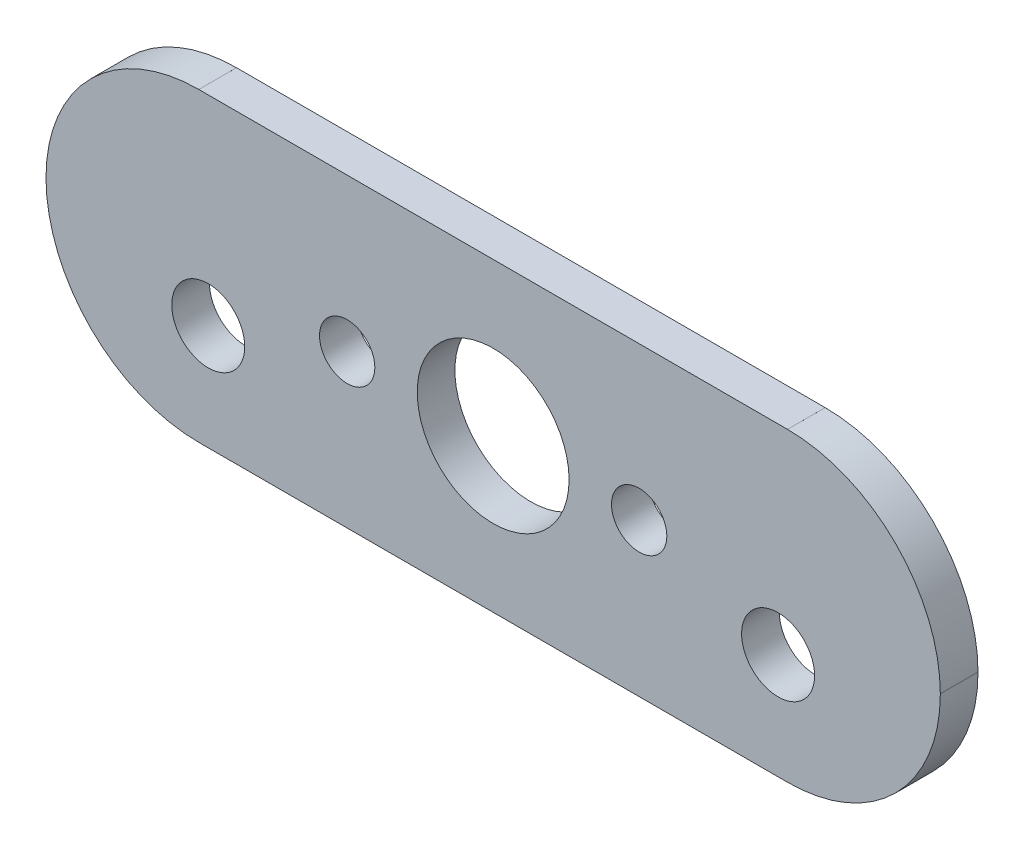
ISO-10303-21;
HEADER;
FILE_DESCRIPTION(('STEP AP214'),'2;1');
FILE_NAME('part.step','',(''),(''),'','','');
FILE_SCHEMA(('AUTOMOTIVE_DESIGN { 1 0 10303 214 1 1 1 1 }'));
ENDSEC;
DATA;
#1=APPLICATION_CONTEXT('core data for automotive mechanical design processes');
#2=APPLICATION_PROTOCOL_DEFINITION('international standard','automotive_design',2000,#1);
#3=PRODUCT_CONTEXT('',#1,'mechanical');
#4=PRODUCT('Part','Part','',(#3));
#5=PRODUCT_RELATED_PRODUCT_CATEGORY('part','',(#4));
#6=PRODUCT_DEFINITION_FORMATION('','',#4);
#7=PRODUCT_DEFINITION_CONTEXT('part definition',#1,'design');
#8=PRODUCT_DEFINITION('design','',#6,#7);
#9=PRODUCT_DEFINITION_SHAPE('','',#8);
#10=(LENGTH_UNIT() NAMED_UNIT(*) SI_UNIT(.MILLI.,.METRE.));
#11=(NAMED_UNIT(*) PLANE_ANGLE_UNIT() SI_UNIT($,.RADIAN.));
#12=(NAMED_UNIT(*) SI_UNIT($,.STERADIAN.) SOLID_ANGLE_UNIT());
#13=UNCERTAINTY_MEASURE_WITH_UNIT(LENGTH_MEASURE(1.E-05),#10,'distance_accuracy_value','');
#14=(GEOMETRIC_REPRESENTATION_CONTEXT(3) GLOBAL_UNCERTAINTY_ASSIGNED_CONTEXT((#13)) GLOBAL_UNIT_ASSIGNED_CONTEXT((#10,
#11,#12)) REPRESENTATION_CONTEXT('',''));
#15=CARTESIAN_POINT('',(0.,0.,0.));
#16=DIRECTION('',(0.,0.,1.));
#17=DIRECTION('',(1.,0.,0.));
#18=AXIS2_PLACEMENT_3D('',#15,#16,#17);
#19=CARTESIAN_POINT('',(-12.4999999999912,-6.49016509789208,1.6));
#20=DIRECTION('',(0.,0.,-1.));
#21=DIRECTION('',(-1.,0.,0.));
#22=AXIS2_PLACEMENT_3D('',#19,#20,#21);
#23=CYLINDRICAL_SURFACE('',#22,0.000299999999999953);
#24=CARTESIAN_POINT('',(-12.4999999999912,-6.49016509789208,0.));
#25=DIRECTION('',(0.,0.,1.));
#26=DIRECTION('',(1.,0.,0.));
#27=AXIS2_PLACEMENT_3D('',#24,#25,#26);
#28=CIRCLE('',#27,0.000299999999999953);
#29=CARTESIAN_POINT('',(-12.4996999999912,-6.49016509753605,0.));
#30=VERTEX_POINT('',#29);
#31=CARTESIAN_POINT('',(-12.5002999999829,-6.49016509095849,0.));
#32=VERTEX_POINT('',#31);
#33=EDGE_CURVE('E183',#30,#32,#28,.T.);
#34=ORIENTED_EDGE('',*,*,#33,.F.);
#35=DIRECTION('',(0.,0.,-1.));
#36=VECTOR('',#35,1.);
#37=CARTESIAN_POINT('',(-12.4996999999912,-6.49016509753605,1.6));
#38=LINE('',#37,#36);
#39=CARTESIAN_POINT('',(-12.4996999999912,-6.49016509753605,1.6));
#40=VERTEX_POINT('',#39);
#41=EDGE_CURVE('E11',#40,#30,#38,.T.);
#42=ORIENTED_EDGE('',*,*,#41,.F.);
#43=CARTESIAN_POINT('',(-12.4999999999912,-6.49016509789208,1.6));
#44=DIRECTION('',(0.,0.,1.));
#45=DIRECTION('',(1.,0.,0.));
#46=AXIS2_PLACEMENT_3D('',#43,#44,#45);
#47=CIRCLE('',#46,0.000299999999999953);
#48=CARTESIAN_POINT('',(-12.5002999999829,-6.49016509095849,1.6));
#49=VERTEX_POINT('',#48);
#50=EDGE_CURVE('E246',#40,#49,#47,.T.);
#51=ORIENTED_EDGE('',*,*,#50,.T.);
#52=DIRECTION('',(0.,0.,-1.));
#53=VECTOR('',#52,1.);
#54=CARTESIAN_POINT('',(-12.5002999999829,-6.49016509095849,1.6));
#55=LINE('',#54,#53);
#56=EDGE_CURVE('E105',#49,#32,#55,.T.);
#57=ORIENTED_EDGE('',*,*,#56,.T.);
#58=EDGE_LOOP('',(#34,#42,#51,#57));
#59=FACE_BOUND('',#58,.T.);
#60=ADVANCED_FACE('F41',(#59),#23,.F.);
#61=CARTESIAN_POINT('',(7.70224696459174E-06,-6.49015026339018,1.6));
#62=DIRECTION('',(-1.18675942035323E-06,0.999999999999296,0.));
#63=DIRECTION('',(-0.999999999999296,-1.18675942035323E-06,0.));
#64=AXIS2_PLACEMENT_3D('',#61,#62,#63);
#65=PLANE('',#64);
#66=DIRECTION('',(0.999999999999296,1.18675942035323E-06,0.));
#67=VECTOR('',#66,1.);
#68=CARTESIAN_POINT('',(7.70224696459174E-06,-6.49015026339018,0.));
#69=LINE('',#68,#67);
#70=CARTESIAN_POINT('',(12.4996999999912,-6.4901354292626,0.));
#71=VERTEX_POINT('',#70);
#72=EDGE_CURVE('E187',#30,#71,#69,.T.);
#73=ORIENTED_EDGE('',*,*,#72,.T.);
#74=DIRECTION('',(0.,0.,-1.));
#75=VECTOR('',#74,1.);
#76=CARTESIAN_POINT('',(12.4996999999912,-6.4901354292626,1.6));
#77=LINE('',#76,#75);
#78=CARTESIAN_POINT('',(12.4996999999912,-6.4901354292626,1.6));
#79=VERTEX_POINT('',#78);
#80=EDGE_CURVE('E50',#79,#71,#77,.T.);
#81=ORIENTED_EDGE('',*,*,#80,.F.);
#82=DIRECTION('',(0.999999999999296,1.18675942035323E-06,0.));
#83=VECTOR('',#82,1.);
#84=CARTESIAN_POINT('',(7.70224696459174E-06,-6.49015026339018,1.6));
#85=LINE('',#84,#83);
#86=EDGE_CURVE('E297',#40,#79,#85,.T.);
#87=ORIENTED_EDGE('',*,*,#86,.F.);
#88=ORIENTED_EDGE('',*,*,#41,.T.);
#89=EDGE_LOOP('',(#73,#81,#87,#88));
#90=FACE_BOUND('',#89,.T.);
#91=ADVANCED_FACE('F280',(#90),#65,.F.);
#92=CARTESIAN_POINT('',(12.4999999999912,-6.49013542890657,1.6));
#93=DIRECTION('',(0.,0.,-1.));
#94=DIRECTION('',(-1.,0.,0.));
#95=AXIS2_PLACEMENT_3D('',#92,#93,#94);
#96=CYLINDRICAL_SURFACE('',#95,0.000299999999999953);
#97=CARTESIAN_POINT('',(12.4999999999912,-6.49013542890657,0.));
#98=DIRECTION('',(0.,0.,1.));
#99=DIRECTION('',(1.,0.,0.));
#100=AXIS2_PLACEMENT_3D('',#97,#98,#99);
#101=CIRCLE('',#100,0.000299999999999953);
#102=CARTESIAN_POINT('',(12.500299999994,-6.49013541502723,0.));
#103=VERTEX_POINT('',#102);
#104=EDGE_CURVE('E191',#103,#71,#101,.T.);
#105=ORIENTED_EDGE('',*,*,#104,.F.);
#106=DIRECTION('',(0.,0.,-1.));
#107=VECTOR('',#106,1.);
#108=CARTESIAN_POINT('',(12.500299999994,-6.49013541502723,1.6));
#109=LINE('',#108,#107);
#110=CARTESIAN_POINT('',(12.500299999994,-6.49013541502723,1.6));
#111=VERTEX_POINT('',#110);
#112=EDGE_CURVE('E268',#111,#103,#109,.T.);
#113=ORIENTED_EDGE('',*,*,#112,.F.);
#114=CARTESIAN_POINT('',(12.4999999999912,-6.49013542890657,1.6));
#115=DIRECTION('',(0.,0.,1.));
#116=DIRECTION('',(1.,0.,0.));
#117=AXIS2_PLACEMENT_3D('',#114,#115,#116);
#118=CIRCLE('',#117,0.000299999999999953);
#119=EDGE_CURVE('E277',#111,#79,#118,.T.);
#120=ORIENTED_EDGE('',*,*,#119,.T.);
#121=ORIENTED_EDGE('',*,*,#80,.T.);
#122=EDGE_LOOP('',(#105,#113,#120,#121));
#123=FACE_BOUND('',#122,.T.);
#124=ADVANCED_FACE('F275',(#123),#96,.F.);
#125=CARTESIAN_POINT('',(12.4998497365919,1.48344927578849E-05,1.6));
#126=DIRECTION('',(0.,0.,-1.));
#127=DIRECTION('',(-1.,0.,0.));
#128=AXIS2_PLACEMENT_3D('',#125,#126,#127);
#129=CYLINDRICAL_SURFACE('',#128,6.49015026513882);
#130=CARTESIAN_POINT('',(12.4998497365919,1.48344927578849E-05,0.));
#131=DIRECTION('',(0.,0.,1.));
#132=DIRECTION('',(1.,0.,0.));
#133=AXIS2_PLACEMENT_3D('',#130,#131,#132);
#134=CIRCLE('',#133,6.49015026513882);
#135=CARTESIAN_POINT('',(18.9899999999912,-0.000135428906555711,0.));
#136=VERTEX_POINT('',#135);
#137=EDGE_CURVE('E195',#103,#136,#134,.T.);
#138=ORIENTED_EDGE('',*,*,#137,.T.);
#139=DIRECTION('',(0.,0.,-1.));
#140=VECTOR('',#139,1.);
#141=CARTESIAN_POINT('',(18.9899999999912,-0.000135428906555711,1.6));
#142=LINE('',#141,#140);
#143=CARTESIAN_POINT('',(18.9899999999912,-0.000135428906555711,1.6));
#144=VERTEX_POINT('',#143);
#145=EDGE_CURVE('E265',#144,#136,#142,.T.);
#146=ORIENTED_EDGE('',*,*,#145,.F.);
#147=CARTESIAN_POINT('',(12.4998497365919,1.48344927578849E-05,1.6));
#148=DIRECTION('',(0.,0.,1.));
#149=DIRECTION('',(1.,0.,0.));
#150=AXIS2_PLACEMENT_3D('',#147,#148,#149);
#151=CIRCLE('',#150,6.49015026513882);
#152=EDGE_CURVE('E292',#111,#144,#151,.T.);
#153=ORIENTED_EDGE('',*,*,#152,.F.);
#154=ORIENTED_EDGE('',*,*,#112,.T.);
#155=EDGE_LOOP('',(#138,#146,#153,#154));
#156=FACE_BOUND('',#155,.T.);
#157=ADVANCED_FACE('F289',(#156),#129,.T.);
#158=CARTESIAN_POINT('',(18.9899999999912,0.,1.6));
#159=DIRECTION('',(1.,0.,0.));
#160=DIRECTION('',(0.,0.,-1.));
#161=AXIS2_PLACEMENT_3D('',#158,#159,#160);
#162=PLANE('',#161);
#163=DIRECTION('',(0.,-1.,0.));
#164=VECTOR('',#163,1.);
#165=CARTESIAN_POINT('',(18.9899999999912,0.,0.));
#166=LINE('',#165,#164);
#167=CARTESIAN_POINT('',(18.9899999999912,0.0198645710934443,0.));
#168=VERTEX_POINT('',#167);
#169=EDGE_CURVE('E199',#168,#136,#166,.T.);
#170=ORIENTED_EDGE('',*,*,#169,.F.);
#171=DIRECTION('',(0.,0.,-1.));
#172=VECTOR('',#171,1.);
#173=CARTESIAN_POINT('',(18.9899999999912,0.0198645710934443,1.6));
#174=LINE('',#173,#172);
#175=CARTESIAN_POINT('',(18.9899999999912,0.0198645710934443,1.6));
#176=VERTEX_POINT('',#175);
#177=EDGE_CURVE('E262',#176,#168,#174,.T.);
#178=ORIENTED_EDGE('',*,*,#177,.F.);
#179=DIRECTION('',(0.,-1.,0.));
#180=VECTOR('',#179,1.);
#181=CARTESIAN_POINT('',(18.9899999999912,0.,1.6));
#182=LINE('',#181,#180);
#183=EDGE_CURVE('E295',#176,#144,#182,.T.);
#184=ORIENTED_EDGE('',*,*,#183,.T.);
#185=ORIENTED_EDGE('',*,*,#145,.T.);
#186=EDGE_LOOP('',(#170,#178,#184,#185));
#187=FACE_BOUND('',#186,.T.);
#188=ADVANCED_FACE('F336',(#187),#162,.T.);
#189=CARTESIAN_POINT('',(12.4998801803508,-1.48351262090757E-05,1.6));
#190=DIRECTION('',(0.,0.,-1.));
#191=DIRECTION('',(-1.,0.,0.));
#192=AXIS2_PLACEMENT_3D('',#189,#190,#191);
#193=CYLINDRICAL_SURFACE('',#192,6.49015026513882);
#194=CARTESIAN_POINT('',(12.4998801803508,-1.48351262090757E-05,0.));
#195=DIRECTION('',(0.,0.,1.));
#196=DIRECTION('',(1.,0.,0.));
#197=AXIS2_PLACEMENT_3D('',#194,#195,#196);
#198=CIRCLE('',#197,6.49015026513882);
#199=CARTESIAN_POINT('',(12.5002999999802,6.49013541643445,0.));
#200=VERTEX_POINT('',#199);
#201=EDGE_CURVE('E203',#168,#200,#198,.T.);
#202=ORIENTED_EDGE('',*,*,#201,.T.);
#203=DIRECTION('',(0.,0.,-1.));
#204=VECTOR('',#203,1.);
#205=CARTESIAN_POINT('',(12.5002999999802,6.49013541643445,1.6));
#206=LINE('',#205,#204);
#207=CARTESIAN_POINT('',(12.5002999999802,6.49013541643445,1.6));
#208=VERTEX_POINT('',#207);
#209=EDGE_CURVE('E259',#208,#200,#206,.T.);
#210=ORIENTED_EDGE('',*,*,#209,.F.);
#211=CARTESIAN_POINT('',(12.4998801803508,-1.48351262090757E-05,1.6));
#212=DIRECTION('',(0.,0.,1.));
#213=DIRECTION('',(1.,0.,0.));
#214=AXIS2_PLACEMENT_3D('',#211,#212,#213);
#215=CIRCLE('',#214,6.49015026513882);
#216=EDGE_CURVE('E306',#176,#208,#215,.T.);
#217=ORIENTED_EDGE('',*,*,#216,.F.);
#218=ORIENTED_EDGE('',*,*,#177,.T.);
#219=EDGE_LOOP('',(#202,#210,#217,#218));
#220=FACE_BOUND('',#219,.T.);
#221=ADVANCED_FACE('F339',(#220),#193,.T.);
#222=CARTESIAN_POINT('',(12.5,6.49013542890657,1.6));
#223=DIRECTION('',(0.,0.,-1.));
#224=DIRECTION('',(-1.,0.,0.));
#225=AXIS2_PLACEMENT_3D('',#222,#223,#224);
#226=CYLINDRICAL_SURFACE('',#225,0.000299999999999953);
#227=CARTESIAN_POINT('',(12.5,6.49013542890657,0.));
#228=DIRECTION('',(0.,0.,1.));
#229=DIRECTION('',(1.,0.,0.));
#230=AXIS2_PLACEMENT_3D('',#227,#228,#229);
#231=CIRCLE('',#230,0.000299999999999953);
#232=CARTESIAN_POINT('',(12.4997,6.49013542890657,0.));
#233=VERTEX_POINT('',#232);
#234=EDGE_CURVE('E207',#233,#200,#231,.T.);
#235=ORIENTED_EDGE('',*,*,#234,.F.);
#236=DIRECTION('',(0.,0.,-1.));
#237=VECTOR('',#236,1.);
#238=CARTESIAN_POINT('',(12.4997,6.49013542890657,1.6));
#239=LINE('',#238,#237);
#240=CARTESIAN_POINT('',(12.4997,6.49013542890657,1.6));
#241=VERTEX_POINT('',#240);
#242=EDGE_CURVE('E256',#241,#233,#239,.T.);
#243=ORIENTED_EDGE('',*,*,#242,.F.);
#244=CARTESIAN_POINT('',(12.5,6.49013542890657,1.6));
#245=DIRECTION('',(0.,0.,1.));
#246=DIRECTION('',(1.,0.,0.));
#247=AXIS2_PLACEMENT_3D('',#244,#245,#246);
#248=CIRCLE('',#247,0.000299999999999953);
#249=EDGE_CURVE('E309',#241,#208,#248,.T.);
#250=ORIENTED_EDGE('',*,*,#249,.T.);
#251=ORIENTED_EDGE('',*,*,#209,.T.);
#252=EDGE_LOOP('',(#235,#243,#250,#251));
#253=FACE_BOUND('',#252,.T.);
#254=ADVANCED_FACE('F343',(#253),#226,.F.);
#255=CARTESIAN_POINT('',(0.,6.49013542890657,1.6));
#256=DIRECTION('',(0.,-1.,0.));
#257=DIRECTION('',(1.,0.,0.));
#258=AXIS2_PLACEMENT_3D('',#255,#256,#257);
#259=PLANE('',#258);
#260=DIRECTION('',(-1.,0.,0.));
#261=VECTOR('',#260,1.);
#262=CARTESIAN_POINT('',(0.,6.49013542890657,0.));
#263=LINE('',#262,#261);
#264=CARTESIAN_POINT('',(-12.4997,6.49013542890657,0.));
#265=VERTEX_POINT('',#264);
#266=EDGE_CURVE('E211',#233,#265,#263,.T.);
#267=ORIENTED_EDGE('',*,*,#266,.T.);
#268=DIRECTION('',(0.,0.,-1.));
#269=VECTOR('',#268,1.);
#270=CARTESIAN_POINT('',(-12.4997,6.49013542890657,1.6));
#271=LINE('',#270,#269);
#272=CARTESIAN_POINT('',(-12.4997,6.49013542890657,1.6));
#273=VERTEX_POINT('',#272);
#274=EDGE_CURVE('E253',#273,#265,#271,.T.);
#275=ORIENTED_EDGE('',*,*,#274,.F.);
#276=DIRECTION('',(-1.,0.,0.));
#277=VECTOR('',#276,1.);
#278=CARTESIAN_POINT('',(0.,6.49013542890657,1.6));
#279=LINE('',#278,#277);
#280=EDGE_CURVE('E313',#241,#273,#279,.T.);
#281=ORIENTED_EDGE('',*,*,#280,.F.);
#282=ORIENTED_EDGE('',*,*,#242,.T.);
#283=EDGE_LOOP('',(#267,#275,#281,#282));
#284=FACE_BOUND('',#283,.T.);
#285=ADVANCED_FACE('F347',(#284),#259,.F.);
#286=CARTESIAN_POINT('',(-12.5,6.49013542890657,1.6));
#287=DIRECTION('',(0.,0.,-1.));
#288=DIRECTION('',(-1.,0.,0.));
#289=AXIS2_PLACEMENT_3D('',#286,#287,#288);
#290=CYLINDRICAL_SURFACE('',#289,0.000299999999999953);
#291=CARTESIAN_POINT('',(-12.5,6.49013542890657,0.));
#292=DIRECTION('',(0.,0.,1.));
#293=DIRECTION('',(1.,0.,0.));
#294=AXIS2_PLACEMENT_3D('',#291,#292,#293);
#295=CIRCLE('',#294,0.000299999999999953);
#296=CARTESIAN_POINT('',(-12.5002999999999,6.49013542197298,0.));
#297=VERTEX_POINT('',#296);
#298=EDGE_CURVE('E215',#297,#265,#295,.T.);
#299=ORIENTED_EDGE('',*,*,#298,.F.);
#300=DIRECTION('',(0.,0.,-1.));
#301=VECTOR('',#300,1.);
#302=CARTESIAN_POINT('',(-12.5002999999999,6.49013542197298,1.6));
#303=LINE('',#302,#301);
#304=CARTESIAN_POINT('',(-12.5002999999999,6.49013542197298,1.6));
#305=VERTEX_POINT('',#304);
#306=EDGE_CURVE('E153',#305,#297,#303,.T.);
#307=ORIENTED_EDGE('',*,*,#306,.F.);
#308=CARTESIAN_POINT('',(-12.5,6.49013542890657,1.6));
#309=DIRECTION('',(0.,0.,1.));
#310=DIRECTION('',(1.,0.,0.));
#311=AXIS2_PLACEMENT_3D('',#308,#309,#310);
#312=CIRCLE('',#311,0.000299999999999953);
#313=EDGE_CURVE('E144',#305,#273,#312,.T.);
#314=ORIENTED_EDGE('',*,*,#313,.T.);
#315=ORIENTED_EDGE('',*,*,#274,.T.);
#316=EDGE_LOOP('',(#299,#307,#314,#315));
#317=FACE_BOUND('',#316,.T.);
#318=ADVANCED_FACE('F318',(#317),#290,.F.);
#319=CARTESIAN_POINT('',(-12.4999999999956,-1.48344927565838E-05,1.6));
#320=DIRECTION('',(0.,0.,-1.));
#321=DIRECTION('',(-1.,0.,0.));
#322=AXIS2_PLACEMENT_3D('',#319,#320,#321);
#323=CYLINDRICAL_SURFACE('',#322,6.49015026339932);
#324=CARTESIAN_POINT('',(-12.4999999999956,-1.48344927565838E-05,0.));
#325=DIRECTION('',(0.,0.,1.));
#326=DIRECTION('',(1.,0.,0.));
#327=AXIS2_PLACEMENT_3D('',#324,#325,#326);
#328=CIRCLE('',#327,6.49015026339932);
#329=CARTESIAN_POINT('',(-18.9901425594085,0.0099851655045528,0.));
#330=VERTEX_POINT('',#329);
#331=EDGE_CURVE('E151',#297,#330,#328,.T.);
#332=ORIENTED_EDGE('',*,*,#331,.T.);
#333=DIRECTION('',(0.,0.,-1.));
#334=VECTOR('',#333,1.);
#335=CARTESIAN_POINT('',(-18.9901425594085,0.0099851655045528,1.6));
#336=LINE('',#335,#334);
#337=CARTESIAN_POINT('',(-18.9901425594085,0.0099851655045528,1.6));
#338=VERTEX_POINT('',#337);
#339=EDGE_CURVE('E148',#338,#330,#336,.T.);
#340=ORIENTED_EDGE('',*,*,#339,.F.);
#341=CARTESIAN_POINT('',(-12.4999999999956,-1.48344927565838E-05,1.6));
#342=DIRECTION('',(0.,0.,1.));
#343=DIRECTION('',(1.,0.,0.));
#344=AXIS2_PLACEMENT_3D('',#341,#342,#343);
#345=CIRCLE('',#344,6.49015026339932);
#346=EDGE_CURVE('E137',#305,#338,#345,.T.);
#347=ORIENTED_EDGE('',*,*,#346,.F.);
#348=ORIENTED_EDGE('',*,*,#306,.T.);
#349=EDGE_LOOP('',(#332,#340,#347,#348));
#350=FACE_BOUND('',#349,.T.);
#351=ADVANCED_FACE('F149',(#350),#323,.T.);
#352=CARTESIAN_POINT('',(-18.9901425594085,0.,1.6));
#353=DIRECTION('',(1.,0.,0.));
#354=DIRECTION('',(0.,0.,-1.));
#355=AXIS2_PLACEMENT_3D('',#352,#353,#354);
#356=PLANE('',#355);
#357=DIRECTION('',(0.,-1.,0.));
#358=VECTOR('',#357,1.);
#359=CARTESIAN_POINT('',(-18.9901425594085,0.,0.));
#360=LINE('',#359,#358);
#361=CARTESIAN_POINT('',(-18.9901425594085,-0.0100148344900868,0.));
#362=VERTEX_POINT('',#361);
#363=EDGE_CURVE('E98',#330,#362,#360,.T.);
#364=ORIENTED_EDGE('',*,*,#363,.T.);
#365=DIRECTION('',(0.,0.,-1.));
#366=VECTOR('',#365,1.);
#367=CARTESIAN_POINT('',(-18.9901425594085,-0.0100148344900868,1.6));
#368=LINE('',#367,#366);
#369=CARTESIAN_POINT('',(-18.9901425594085,-0.0100148344900868,1.6));
#370=VERTEX_POINT('',#369);
#371=EDGE_CURVE('E154',#370,#362,#368,.T.);
#372=ORIENTED_EDGE('',*,*,#371,.F.);
#373=DIRECTION('',(0.,-1.,0.));
#374=VECTOR('',#373,1.);
#375=CARTESIAN_POINT('',(-18.9901425594085,0.,1.6));
#376=LINE('',#375,#374);
#377=EDGE_CURVE('E142',#338,#370,#376,.T.);
#378=ORIENTED_EDGE('',*,*,#377,.F.);
#379=ORIENTED_EDGE('',*,*,#339,.T.);
#380=EDGE_LOOP('',(#364,#372,#378,#379));
#381=FACE_BOUND('',#380,.T.);
#382=ADVANCED_FACE('F156',(#381),#356,.F.);
#383=CARTESIAN_POINT('',(6.2,0.,1.6));
#384=DIRECTION('',(0.,0.,-1.));
#385=DIRECTION('',(-1.,0.,0.));
#386=AXIS2_PLACEMENT_3D('',#383,#384,#385);
#387=CYLINDRICAL_SURFACE('',#386,1.175);
#388=CARTESIAN_POINT('',(6.2,0.,1.6));
#389=DIRECTION('',(0.,0.,1.));
#390=DIRECTION('',(1.,0.,0.));
#391=AXIS2_PLACEMENT_3D('',#388,#389,#390);
#392=CIRCLE('',#391,1.175);
#393=CARTESIAN_POINT('',(7.375,0.,1.6));
#394=VERTEX_POINT('',#393);
#395=EDGE_CURVE('E175',#394,#394,#392,.T.);
#396=ORIENTED_EDGE('',*,*,#395,.T.);
#397=EDGE_LOOP('',(#396));
#398=FACE_BOUND('',#397,.T.);
#399=CARTESIAN_POINT('',(6.2,0.,0.));
#400=DIRECTION('',(0.,0.,1.));
#401=DIRECTION('',(1.,0.,0.));
#402=AXIS2_PLACEMENT_3D('',#399,#400,#401);
#403=CIRCLE('',#402,1.175);
#404=CARTESIAN_POINT('',(7.375,0.,0.));
#405=VERTEX_POINT('',#404);
#406=EDGE_CURVE('E238',#405,#405,#403,.T.);
#407=ORIENTED_EDGE('',*,*,#406,.F.);
#408=EDGE_LOOP('',(#407));
#409=FACE_BOUND('',#408,.T.);
#410=ADVANCED_FACE('F358',(#398,#409),#387,.F.);
#411=CARTESIAN_POINT('',(0.,-1.24332070293494E-10,1.6));
#412=DIRECTION('',(0.,0.,-1.));
#413=DIRECTION('',(-1.,0.,0.));
#414=AXIS2_PLACEMENT_3D('',#411,#412,#413);
#415=CYLINDRICAL_SURFACE('',#414,3.225);
#416=CARTESIAN_POINT('',(0.,-1.24332070293494E-10,1.6));
#417=DIRECTION('',(0.,0.,1.));
#418=DIRECTION('',(1.,0.,0.));
#419=AXIS2_PLACEMENT_3D('',#416,#417,#418);
#420=CIRCLE('',#419,3.225);
#421=CARTESIAN_POINT('',(3.225,-1.24332070293494E-10,1.6));
#422=VERTEX_POINT('',#421);
#423=EDGE_CURVE('E171',#422,#422,#420,.T.);
#424=ORIENTED_EDGE('',*,*,#423,.T.);
#425=EDGE_LOOP('',(#424));
#426=FACE_BOUND('',#425,.T.);
#427=CARTESIAN_POINT('',(0.,-1.24332070293494E-10,0.));
#428=DIRECTION('',(0.,0.,1.));
#429=DIRECTION('',(1.,0.,0.));
#430=AXIS2_PLACEMENT_3D('',#427,#428,#429);
#431=CIRCLE('',#430,3.225);
#432=CARTESIAN_POINT('',(3.225,-1.24332070293494E-10,0.));
#433=VERTEX_POINT('',#432);
#434=EDGE_CURVE('E234',#433,#433,#431,.T.);
#435=ORIENTED_EDGE('',*,*,#434,.F.);
#436=EDGE_LOOP('',(#435));
#437=FACE_BOUND('',#436,.T.);
#438=ADVANCED_FACE('F369',(#426,#437),#415,.F.);
#439=CARTESIAN_POINT('',(-12.1,-2.00000000012433,1.6));
#440=DIRECTION('',(0.,0.,-1.));
#441=DIRECTION('',(-1.,0.,0.));
#442=AXIS2_PLACEMENT_3D('',#439,#440,#441);
#443=CYLINDRICAL_SURFACE('',#442,1.55);
#444=CARTESIAN_POINT('',(-12.1,-2.00000000012433,1.6));
#445=DIRECTION('',(0.,0.,1.));
#446=DIRECTION('',(1.,0.,0.));
#447=AXIS2_PLACEMENT_3D('',#444,#445,#446);
#448=CIRCLE('',#447,1.55);
#449=CARTESIAN_POINT('',(-10.55,-2.00000000012433,1.6));
#450=VERTEX_POINT('',#449);
#451=EDGE_CURVE('E167',#450,#450,#448,.T.);
#452=ORIENTED_EDGE('',*,*,#451,.T.);
#453=EDGE_LOOP('',(#452));
#454=FACE_BOUND('',#453,.T.);
#455=CARTESIAN_POINT('',(-12.1,-2.00000000012433,0.));
#456=DIRECTION('',(0.,0.,1.));
#457=DIRECTION('',(1.,0.,0.));
#458=AXIS2_PLACEMENT_3D('',#455,#456,#457);
#459=CIRCLE('',#458,1.55);
#460=CARTESIAN_POINT('',(-10.55,-2.00000000012433,0.));
#461=VERTEX_POINT('',#460);
#462=EDGE_CURVE('E230',#461,#461,#459,.T.);
#463=ORIENTED_EDGE('',*,*,#462,.F.);
#464=EDGE_LOOP('',(#463));
#465=FACE_BOUND('',#464,.T.);
#466=ADVANCED_FACE('F365',(#454,#465),#443,.F.);
#467=CARTESIAN_POINT('',(12.1,-2.00000000012433,1.6));
#468=DIRECTION('',(0.,0.,-1.));
#469=DIRECTION('',(-1.,0.,0.));
#470=AXIS2_PLACEMENT_3D('',#467,#468,#469);
#471=CYLINDRICAL_SURFACE('',#470,1.55);
#472=CARTESIAN_POINT('',(12.1,-2.00000000012433,1.6));
#473=DIRECTION('',(0.,0.,1.));
#474=DIRECTION('',(1.,0.,0.));
#475=AXIS2_PLACEMENT_3D('',#472,#473,#474);
#476=CIRCLE('',#475,1.55);
#477=CARTESIAN_POINT('',(13.65,-2.00000000012433,1.6));
#478=VERTEX_POINT('',#477);
#479=EDGE_CURVE('E160',#478,#478,#476,.F.);
#480=ORIENTED_EDGE('',*,*,#479,.F.);
#481=EDGE_LOOP('',(#480));
#482=FACE_BOUND('',#481,.T.);
#483=CARTESIAN_POINT('',(12.1,-2.00000000012433,0.));
#484=DIRECTION('',(0.,0.,1.));
#485=DIRECTION('',(1.,0.,0.));
#486=AXIS2_PLACEMENT_3D('',#483,#484,#485);
#487=CIRCLE('',#486,1.55);
#488=CARTESIAN_POINT('',(13.65,-2.00000000012433,0.));
#489=VERTEX_POINT('',#488);
#490=EDGE_CURVE('E226',#489,#489,#487,.F.);
#491=ORIENTED_EDGE('',*,*,#490,.T.);
#492=EDGE_LOOP('',(#491));
#493=FACE_BOUND('',#492,.T.);
#494=ADVANCED_FACE('F362',(#482,#493),#471,.F.);
#495=CARTESIAN_POINT('',(-12.4999999999956,-1.48344927565838E-05,1.6));
#496=DIRECTION('',(0.,0.,-1.));
#497=DIRECTION('',(-1.,0.,0.));
#498=AXIS2_PLACEMENT_3D('',#495,#496,#497);
#499=CYLINDRICAL_SURFACE('',#498,6.49015026339932);
#500=CARTESIAN_POINT('',(-12.4999999999956,-1.48344927565838E-05,0.));
#501=DIRECTION('',(0.,0.,1.));
#502=DIRECTION('',(1.,0.,0.));
#503=AXIS2_PLACEMENT_3D('',#500,#501,#502);
#504=CIRCLE('',#503,6.49015026339932);
#505=EDGE_CURVE('E223',#362,#32,#504,.T.);
#506=ORIENTED_EDGE('',*,*,#505,.T.);
#507=ORIENTED_EDGE('',*,*,#56,.F.);
#508=CARTESIAN_POINT('',(-12.4999999999956,-1.48344927565838E-05,1.6));
#509=DIRECTION('',(0.,0.,1.));
#510=DIRECTION('',(1.,0.,0.));
#511=AXIS2_PLACEMENT_3D('',#508,#509,#510);
#512=CIRCLE('',#511,6.49015026339932);
#513=EDGE_CURVE('E58',#370,#49,#512,.T.);
#514=ORIENTED_EDGE('',*,*,#513,.F.);
#515=ORIENTED_EDGE('',*,*,#371,.T.);
#516=EDGE_LOOP('',(#506,#507,#514,#515));
#517=FACE_BOUND('',#516,.T.);
#518=ADVANCED_FACE('F323',(#517),#499,.T.);
#519=CARTESIAN_POINT('',(-6.2,0.,1.6));
#520=DIRECTION('',(0.,0.,-1.));
#521=DIRECTION('',(-1.,0.,0.));
#522=AXIS2_PLACEMENT_3D('',#519,#520,#521);
#523=CYLINDRICAL_SURFACE('',#522,1.175);
#524=CARTESIAN_POINT('',(-6.2,0.,1.6));
#525=DIRECTION('',(0.,0.,1.));
#526=DIRECTION('',(1.,0.,0.));
#527=AXIS2_PLACEMENT_3D('',#524,#525,#526);
#528=CIRCLE('',#527,1.175);
#529=CARTESIAN_POINT('',(-5.025,0.,1.6));
#530=VERTEX_POINT('',#529);
#531=EDGE_CURVE('E179',#530,#530,#528,.T.);
#532=ORIENTED_EDGE('',*,*,#531,.T.);
#533=EDGE_LOOP('',(#532));
#534=FACE_BOUND('',#533,.T.);
#535=CARTESIAN_POINT('',(-6.2,0.,0.));
#536=DIRECTION('',(0.,0.,1.));
#537=DIRECTION('',(1.,0.,0.));
#538=AXIS2_PLACEMENT_3D('',#535,#536,#537);
#539=CIRCLE('',#538,1.175);
#540=CARTESIAN_POINT('',(-5.025,0.,0.));
#541=VERTEX_POINT('',#540);
#542=EDGE_CURVE('E242',#541,#541,#539,.T.);
#543=ORIENTED_EDGE('',*,*,#542,.F.);
#544=EDGE_LOOP('',(#543));
#545=FACE_BOUND('',#544,.T.);
#546=ADVANCED_FACE('F361',(#534,#545),#523,.F.);
#547=CARTESIAN_POINT('',(0.,0.,1.6));
#548=DIRECTION('',(0.,0.,1.));
#549=DIRECTION('',(1.,0.,0.));
#550=AXIS2_PLACEMENT_3D('',#547,#548,#549);
#551=PLANE('',#550);
#552=ORIENTED_EDGE('',*,*,#50,.F.);
#553=ORIENTED_EDGE('',*,*,#86,.T.);
#554=ORIENTED_EDGE('',*,*,#119,.F.);
#555=ORIENTED_EDGE('',*,*,#152,.T.);
#556=ORIENTED_EDGE('',*,*,#183,.F.);
#557=ORIENTED_EDGE('',*,*,#216,.T.);
#558=ORIENTED_EDGE('',*,*,#249,.F.);
#559=ORIENTED_EDGE('',*,*,#280,.T.);
#560=ORIENTED_EDGE('',*,*,#313,.F.);
#561=ORIENTED_EDGE('',*,*,#346,.T.);
#562=ORIENTED_EDGE('',*,*,#377,.T.);
#563=ORIENTED_EDGE('',*,*,#513,.T.);
#564=EDGE_LOOP('',(#552,#553,#554,#555,#556,#557,#558,#559,#560,#561,#562,#563));
#565=FACE_BOUND('',#564,.T.);
#566=ORIENTED_EDGE('',*,*,#479,.T.);
#567=EDGE_LOOP('',(#566));
#568=FACE_BOUND('',#567,.T.);
#569=ORIENTED_EDGE('',*,*,#451,.F.);
#570=EDGE_LOOP('',(#569));
#571=FACE_BOUND('',#570,.T.);
#572=ORIENTED_EDGE('',*,*,#423,.F.);
#573=EDGE_LOOP('',(#572));
#574=FACE_BOUND('',#573,.T.);
#575=ORIENTED_EDGE('',*,*,#395,.F.);
#576=EDGE_LOOP('',(#575));
#577=FACE_BOUND('',#576,.T.);
#578=ORIENTED_EDGE('',*,*,#531,.F.);
#579=EDGE_LOOP('',(#578));
#580=FACE_BOUND('',#579,.T.);
#581=ADVANCED_FACE('F139',(#565,#568,#571,#574,#577,#580),#551,.T.);
#582=CARTESIAN_POINT('',(0.,0.,0.));
#583=DIRECTION('',(0.,0.,1.));
#584=DIRECTION('',(1.,0.,0.));
#585=AXIS2_PLACEMENT_3D('',#582,#583,#584);
#586=PLANE('',#585);
#587=ORIENTED_EDGE('',*,*,#33,.T.);
#588=ORIENTED_EDGE('',*,*,#505,.F.);
#589=ORIENTED_EDGE('',*,*,#363,.F.);
#590=ORIENTED_EDGE('',*,*,#331,.F.);
#591=ORIENTED_EDGE('',*,*,#298,.T.);
#592=ORIENTED_EDGE('',*,*,#266,.F.);
#593=ORIENTED_EDGE('',*,*,#234,.T.);
#594=ORIENTED_EDGE('',*,*,#201,.F.);
#595=ORIENTED_EDGE('',*,*,#169,.T.);
#596=ORIENTED_EDGE('',*,*,#137,.F.);
#597=ORIENTED_EDGE('',*,*,#104,.T.);
#598=ORIENTED_EDGE('',*,*,#72,.F.);
#599=EDGE_LOOP('',(#587,#588,#589,#590,#591,#592,#593,#594,#595,#596,#597,#598));
#600=FACE_BOUND('',#599,.T.);
#601=ORIENTED_EDGE('',*,*,#490,.F.);
#602=EDGE_LOOP('',(#601));
#603=FACE_BOUND('',#602,.T.);
#604=ORIENTED_EDGE('',*,*,#462,.T.);
#605=EDGE_LOOP('',(#604));
#606=FACE_BOUND('',#605,.T.);
#607=ORIENTED_EDGE('',*,*,#434,.T.);
#608=EDGE_LOOP('',(#607));
#609=FACE_BOUND('',#608,.T.);
#610=ORIENTED_EDGE('',*,*,#406,.T.);
#611=EDGE_LOOP('',(#610));
#612=FACE_BOUND('',#611,.T.);
#613=ORIENTED_EDGE('',*,*,#542,.T.);
#614=EDGE_LOOP('',(#613));
#615=FACE_BOUND('',#614,.T.);
#616=ADVANCED_FACE('F283',(#600,#603,#606,#609,#612,#615),#586,.F.);
#617=CLOSED_SHELL('',(#60,#91,#124,#157,#188,#221,#254,#285,#318,#351,#382,#410,#438,#466,#494,
#518,#546,#581,#616));
#618=MANIFOLD_SOLID_BREP('B2',#617);
#619=ADVANCED_BREP_SHAPE_REPRESENTATION('',(#18,#618),#14);
#620=SHAPE_DEFINITION_REPRESENTATION(#9,#619);
ENDSEC;
END-ISO-10303-21;
